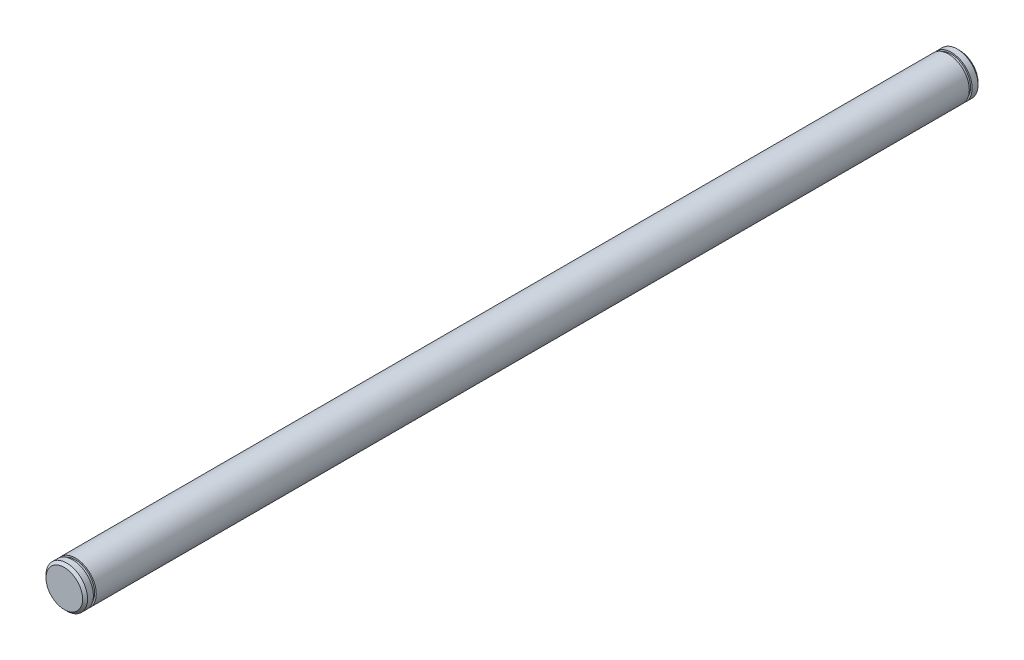
ISO-10303-21;
HEADER;
FILE_DESCRIPTION(('STEP AP214'),'2;1');
FILE_NAME('part.step','',(''),(''),'','','');
FILE_SCHEMA(('AUTOMOTIVE_DESIGN { 1 0 10303 214 1 1 1 1 }'));
ENDSEC;
DATA;
#1=APPLICATION_CONTEXT('core data for automotive mechanical design processes');
#2=APPLICATION_PROTOCOL_DEFINITION('international standard','automotive_design',2000,#1);
#3=PRODUCT_CONTEXT('',#1,'mechanical');
#4=PRODUCT('Part','Part','',(#3));
#5=PRODUCT_RELATED_PRODUCT_CATEGORY('part','',(#4));
#6=PRODUCT_DEFINITION_FORMATION('','',#4);
#7=PRODUCT_DEFINITION_CONTEXT('part definition',#1,'design');
#8=PRODUCT_DEFINITION('design','',#6,#7);
#9=PRODUCT_DEFINITION_SHAPE('','',#8);
#10=(LENGTH_UNIT() NAMED_UNIT(*) SI_UNIT(.MILLI.,.METRE.));
#11=(NAMED_UNIT(*) PLANE_ANGLE_UNIT() SI_UNIT($,.RADIAN.));
#12=(NAMED_UNIT(*) SI_UNIT($,.STERADIAN.) SOLID_ANGLE_UNIT());
#13=UNCERTAINTY_MEASURE_WITH_UNIT(LENGTH_MEASURE(1.E-05),#10,'distance_accuracy_value','');
#14=(GEOMETRIC_REPRESENTATION_CONTEXT(3) GLOBAL_UNCERTAINTY_ASSIGNED_CONTEXT((#13)) GLOBAL_UNIT_ASSIGNED_CONTEXT((#10,
#11,#12)) REPRESENTATION_CONTEXT('',''));
#15=CARTESIAN_POINT('',(0.,0.,0.));
#16=DIRECTION('',(0.,0.,1.));
#17=DIRECTION('',(1.,0.,0.));
#18=AXIS2_PLACEMENT_3D('',#15,#16,#17);
#19=CARTESIAN_POINT('',(0.,0.,133.4008));
#20=DIRECTION('',(0.,0.,1.));
#21=DIRECTION('',(1.,0.,0.));
#22=AXIS2_PLACEMENT_3D('',#19,#20,#21);
#23=PLANE('',#22);
#24=CARTESIAN_POINT('',(0.,0.,133.4008));
#25=DIRECTION('',(0.,0.,1.));
#26=DIRECTION('',(1.,0.,0.));
#27=AXIS2_PLACEMENT_3D('',#24,#25,#26);
#28=CIRCLE('',#27,6.35);
#29=CARTESIAN_POINT('',(6.35,0.,133.4008));
#30=VERTEX_POINT('',#29);
#31=EDGE_CURVE('E51',#30,#30,#28,.T.);
#32=ORIENTED_EDGE('',*,*,#31,.T.);
#33=EDGE_LOOP('',(#32));
#34=FACE_BOUND('',#33,.T.);
#35=CARTESIAN_POINT('',(0.,0.,133.4008));
#36=DIRECTION('',(0.,0.,1.));
#37=DIRECTION('',(1.,0.,0.));
#38=AXIS2_PLACEMENT_3D('',#35,#36,#37);
#39=CIRCLE('',#38,5.8547);
#40=CARTESIAN_POINT('',(5.8547,0.,133.4008));
#41=VERTEX_POINT('',#40);
#42=EDGE_CURVE('E58',#41,#41,#39,.T.);
#43=ORIENTED_EDGE('',*,*,#42,.F.);
#44=EDGE_LOOP('',(#43));
#45=FACE_BOUND('',#44,.T.);
#46=ADVANCED_FACE('F31',(#34,#45),#23,.T.);
#47=CARTESIAN_POINT('',(0.,0.,133.4008));
#48=DIRECTION('',(0.,0.,-1.));
#49=DIRECTION('',(-1.,0.,0.));
#50=AXIS2_PLACEMENT_3D('',#47,#48,#49);
#51=CYLINDRICAL_SURFACE('',#50,6.35);
#52=ORIENTED_EDGE('',*,*,#31,.F.);
#53=EDGE_LOOP('',(#52));
#54=FACE_BOUND('',#53,.T.);
#55=CARTESIAN_POINT('',(0.,0.,-133.4008));
#56=DIRECTION('',(0.,0.,1.));
#57=DIRECTION('',(1.,0.,0.));
#58=AXIS2_PLACEMENT_3D('',#55,#56,#57);
#59=CIRCLE('',#58,6.35);
#60=CARTESIAN_POINT('',(6.35,0.,-133.4008));
#61=VERTEX_POINT('',#60);
#62=EDGE_CURVE('E52',#61,#61,#59,.T.);
#63=ORIENTED_EDGE('',*,*,#62,.T.);
#64=EDGE_LOOP('',(#63));
#65=FACE_BOUND('',#64,.T.);
#66=ADVANCED_FACE('F93',(#54,#65),#51,.T.);
#67=CARTESIAN_POINT('',(0.,0.,-133.4008));
#68=DIRECTION('',(0.,0.,1.));
#69=DIRECTION('',(1.,0.,0.));
#70=AXIS2_PLACEMENT_3D('',#67,#68,#69);
#71=PLANE('',#70);
#72=CARTESIAN_POINT('',(0.,0.,-133.4008));
#73=DIRECTION('',(0.,0.,1.));
#74=DIRECTION('',(1.,0.,0.));
#75=AXIS2_PLACEMENT_3D('',#72,#73,#74);
#76=CIRCLE('',#75,5.8547);
#77=CARTESIAN_POINT('',(5.8547,0.,-133.4008));
#78=VERTEX_POINT('',#77);
#79=EDGE_CURVE('E66',#78,#78,#76,.T.);
#80=ORIENTED_EDGE('',*,*,#79,.T.);
#81=EDGE_LOOP('',(#80));
#82=FACE_BOUND('',#81,.T.);
#83=ORIENTED_EDGE('',*,*,#62,.F.);
#84=EDGE_LOOP('',(#83));
#85=FACE_BOUND('',#84,.T.);
#86=ADVANCED_FACE('F99',(#82,#85),#71,.F.);
#87=CARTESIAN_POINT('',(0.,0.,134.2898));
#88=DIRECTION('',(0.,0.,-1.));
#89=DIRECTION('',(-1.,0.,0.));
#90=AXIS2_PLACEMENT_3D('',#87,#88,#89);
#91=CYLINDRICAL_SURFACE('',#90,5.8547);
#92=CARTESIAN_POINT('',(0.,0.,134.2898));
#93=DIRECTION('',(0.,0.,1.));
#94=DIRECTION('',(1.,0.,0.));
#95=AXIS2_PLACEMENT_3D('',#92,#93,#94);
#96=CIRCLE('',#95,5.8547);
#97=CARTESIAN_POINT('',(5.8547,0.,134.2898));
#98=VERTEX_POINT('',#97);
#99=EDGE_CURVE('E55',#98,#98,#96,.T.);
#100=ORIENTED_EDGE('',*,*,#99,.F.);
#101=EDGE_LOOP('',(#100));
#102=FACE_BOUND('',#101,.T.);
#103=ORIENTED_EDGE('',*,*,#42,.T.);
#104=EDGE_LOOP('',(#103));
#105=FACE_BOUND('',#104,.T.);
#106=ADVANCED_FACE('F105',(#102,#105),#91,.T.);
#107=CARTESIAN_POINT('',(0.,0.,134.2898));
#108=DIRECTION('',(0.,0.,1.));
#109=DIRECTION('',(1.,0.,0.));
#110=AXIS2_PLACEMENT_3D('',#107,#108,#109);
#111=PLANE('',#110);
#112=CARTESIAN_POINT('',(0.,0.,134.2898));
#113=DIRECTION('',(0.,0.,1.));
#114=DIRECTION('',(1.,0.,0.));
#115=AXIS2_PLACEMENT_3D('',#112,#113,#114);
#116=CIRCLE('',#115,6.35);
#117=CARTESIAN_POINT('',(6.35,0.,134.2898));
#118=VERTEX_POINT('',#117);
#119=EDGE_CURVE('E61',#118,#118,#116,.T.);
#120=ORIENTED_EDGE('',*,*,#119,.F.);
#121=EDGE_LOOP('',(#120));
#122=FACE_BOUND('',#121,.T.);
#123=ORIENTED_EDGE('',*,*,#99,.T.);
#124=EDGE_LOOP('',(#123));
#125=FACE_BOUND('',#124,.T.);
#126=ADVANCED_FACE('F124',(#122,#125),#111,.F.);
#127=CARTESIAN_POINT('',(0.,0.,136.8298));
#128=DIRECTION('',(0.,0.,-1.));
#129=DIRECTION('',(-1.,0.,0.));
#130=AXIS2_PLACEMENT_3D('',#127,#128,#129);
#131=CYLINDRICAL_SURFACE('',#130,6.35);
#132=CARTESIAN_POINT('',(0.,0.,136.0678));
#133=DIRECTION('',(0.,0.,1.));
#134=DIRECTION('',(1.,0.,0.));
#135=AXIS2_PLACEMENT_3D('',#132,#133,#134);
#136=CIRCLE('',#135,6.35);
#137=CARTESIAN_POINT('',(-6.35000000000001,0.,136.0678));
#138=VERTEX_POINT('',#137);
#139=EDGE_CURVE('E42',#138,#138,#136,.F.);
#140=ORIENTED_EDGE('',*,*,#139,.T.);
#141=EDGE_LOOP('',(#140));
#142=FACE_BOUND('',#141,.T.);
#143=ORIENTED_EDGE('',*,*,#119,.T.);
#144=EDGE_LOOP('',(#143));
#145=FACE_BOUND('',#144,.T.);
#146=ADVANCED_FACE('F115',(#142,#145),#131,.T.);
#147=CARTESIAN_POINT('',(0.,0.,136.8298));
#148=DIRECTION('',(0.,0.,1.));
#149=DIRECTION('',(1.,0.,0.));
#150=AXIS2_PLACEMENT_3D('',#147,#148,#149);
#151=PLANE('',#150);
#152=CARTESIAN_POINT('',(0.,0.,136.8298));
#153=DIRECTION('',(0.,0.,1.));
#154=DIRECTION('',(1.,0.,0.));
#155=AXIS2_PLACEMENT_3D('',#152,#153,#154);
#156=CIRCLE('',#155,5.58800000000001);
#157=CARTESIAN_POINT('',(-5.58800000000002,0.,136.8298));
#158=VERTEX_POINT('',#157);
#159=EDGE_CURVE('E46',#158,#158,#156,.T.);
#160=ORIENTED_EDGE('',*,*,#159,.T.);
#161=EDGE_LOOP('',(#160));
#162=FACE_BOUND('',#161,.T.);
#163=ADVANCED_FACE('F110',(#162),#151,.T.);
#164=CARTESIAN_POINT('',(0.,0.,136.8298));
#165=DIRECTION('',(0.,0.,-1.));
#166=DIRECTION('',(-1.,0.,0.));
#167=AXIS2_PLACEMENT_3D('',#164,#165,#166);
#168=CONICAL_SURFACE('',#167,5.58800000000001,0.785398163397434);
#169=CARTESIAN_POINT('',(-6.35000000000001,0.,136.0678));
#170=CARTESIAN_POINT('',(-6.34206250000002,0.,136.0757375));
#171=CARTESIAN_POINT('',(-6.33412500000002,0.,136.083675));
#172=CARTESIAN_POINT('',(-6.31825000000002,0.,136.09955));
#173=CARTESIAN_POINT('',(-6.31031250000001,0.,136.1074875));
#174=CARTESIAN_POINT('',(-6.29443750000001,0.,136.1233625));
#175=CARTESIAN_POINT('',(-6.28650000000002,0.,136.1313));
#176=CARTESIAN_POINT('',(-6.27062500000001,0.,136.147175));
#177=CARTESIAN_POINT('',(-6.26268750000002,0.,136.1551125));
#178=CARTESIAN_POINT('',(-6.24681250000001,0.,136.1709875));
#179=CARTESIAN_POINT('',(-6.23887500000002,0.,136.178925));
#180=CARTESIAN_POINT('',(-6.22300000000001,0.,136.1948));
#181=CARTESIAN_POINT('',(-6.21506250000002,0.,136.2027375));
#182=CARTESIAN_POINT('',(-6.19918750000002,0.,136.2186125));
#183=CARTESIAN_POINT('',(-6.19125000000002,0.,136.22655));
#184=CARTESIAN_POINT('',(-6.17537500000002,0.,136.242425));
#185=CARTESIAN_POINT('',(-6.16743750000002,0.,136.2503625));
#186=CARTESIAN_POINT('',(-6.15156250000002,0.,136.2662375));
#187=CARTESIAN_POINT('',(-6.14362500000002,0.,136.274175));
#188=CARTESIAN_POINT('',(-6.12775000000001,0.,136.29005));
#189=CARTESIAN_POINT('',(-6.11981250000001,0.,136.2979875));
#190=CARTESIAN_POINT('',(-6.10393750000001,0.,136.3138625));
#191=CARTESIAN_POINT('',(-6.09600000000002,0.,136.3218));
#192=CARTESIAN_POINT('',(-6.08012500000002,0.,136.337675));
#193=CARTESIAN_POINT('',(-6.07218750000002,0.,136.3456125));
#194=CARTESIAN_POINT('',(-6.05631250000002,0.,136.3614875));
#195=CARTESIAN_POINT('',(-6.04837500000002,0.,136.369425));
#196=CARTESIAN_POINT('',(-6.03250000000002,0.,136.3853));
#197=CARTESIAN_POINT('',(-6.02456250000002,0.,136.3932375));
#198=CARTESIAN_POINT('',(-6.00868750000002,0.,136.4091125));
#199=CARTESIAN_POINT('',(-6.00075000000002,0.,136.41705));
#200=CARTESIAN_POINT('',(-5.98487500000002,0.,136.432925));
#201=CARTESIAN_POINT('',(-5.97693750000002,0.,136.4408625));
#202=CARTESIAN_POINT('',(-5.96106250000002,0.,136.4567375));
#203=CARTESIAN_POINT('',(-5.95312500000002,0.,136.464675));
#204=CARTESIAN_POINT('',(-5.93725000000002,0.,136.48055));
#205=CARTESIAN_POINT('',(-5.92931250000002,0.,136.4884875));
#206=CARTESIAN_POINT('',(-5.91343750000002,0.,136.5043625));
#207=CARTESIAN_POINT('',(-5.90550000000002,0.,136.5123));
#208=CARTESIAN_POINT('',(-5.88962500000002,0.,136.528175));
#209=CARTESIAN_POINT('',(-5.88168750000002,0.,136.5361125));
#210=CARTESIAN_POINT('',(-5.86581250000002,0.,136.5519875));
#211=CARTESIAN_POINT('',(-5.85787500000002,0.,136.559925));
#212=CARTESIAN_POINT('',(-5.84200000000002,0.,136.5758));
#213=CARTESIAN_POINT('',(-5.83406250000002,0.,136.5837375));
#214=CARTESIAN_POINT('',(-5.81818750000002,0.,136.5996125));
#215=CARTESIAN_POINT('',(-5.81025000000002,0.,136.60755));
#216=CARTESIAN_POINT('',(-5.79437500000002,0.,136.623425));
#217=CARTESIAN_POINT('',(-5.78643750000002,0.,136.6313625));
#218=CARTESIAN_POINT('',(-5.77056250000002,0.,136.6472375));
#219=CARTESIAN_POINT('',(-5.76262500000002,0.,136.655175));
#220=CARTESIAN_POINT('',(-5.74675000000002,0.,136.67105));
#221=CARTESIAN_POINT('',(-5.73881250000002,0.,136.6789875));
#222=CARTESIAN_POINT('',(-5.72293750000002,0.,136.6948625));
#223=CARTESIAN_POINT('',(-5.71500000000002,0.,136.7028));
#224=CARTESIAN_POINT('',(-5.69912500000002,0.,136.718675));
#225=CARTESIAN_POINT('',(-5.69118750000002,0.,136.7266125));
#226=CARTESIAN_POINT('',(-5.67531250000002,0.,136.7424875));
#227=CARTESIAN_POINT('',(-5.66737500000002,0.,136.750425));
#228=CARTESIAN_POINT('',(-5.65150000000002,0.,136.7663));
#229=CARTESIAN_POINT('',(-5.64356250000002,0.,136.7742375));
#230=CARTESIAN_POINT('',(-5.62768750000002,0.,136.7901125));
#231=CARTESIAN_POINT('',(-5.61975000000002,0.,136.79805));
#232=CARTESIAN_POINT('',(-5.60387500000002,0.,136.813925));
#233=CARTESIAN_POINT('',(-5.59593750000002,0.,136.8218625));
#234=CARTESIAN_POINT('',(-5.58800000000002,0.,136.8298));
#235=B_SPLINE_CURVE_WITH_KNOTS('',3,(#169,#170,#171,#172,#173,#174,#175,#176,#177,#178,#179,
#180,#181,#182,#183,#184,#185,#186,#187,#188,#189,#190,#191,#192,#193,#194,#195,#196,#197,#198,
#199,#200,#201,#202,#203,#204,#205,#206,#207,#208,#209,#210,#211,#212,#213,#214,#215,#216,#217,
#218,#219,#220,#221,#222,#223,#224,#225,#226,#227,#228,#229,#230,#231,#232,#233,#234),
.UNSPECIFIED.,.F.,.F.,(4,2,2,2,2,2,2,2,2,2,2,2,2,2,2,2,2,2,2,2,2,2,2,2,2,2,2,2,2,2,2,2,4),(0.,
0.0336759604540271,0.0673519209080345,0.101027881362042,0.134703841816049,0.168379802270057,
0.202055762724065,0.235731723178072,0.26940768363208,0.303083644086088,0.336759604540095,
0.370435564994122,0.40411152544813,0.437787485902137,0.471463446356145,0.505139406810153,
0.53881536726416,0.572491327718167,0.606167288172175,0.639843248626182,0.67351920908019,
0.707195169534198,0.740871129988225,0.774547090442232,0.808223050896239,0.841899011350247,
0.875574971804255,0.909250932258262,0.94292689271227,0.976602853166277,1.01027881362029,
1.04395477407429,1.07763073452832),.UNSPECIFIED.);
#236=EDGE_CURVE('BSEAM88',#138,#158,#235,.T.);
#237=ORIENTED_EDGE('',*,*,#139,.F.);
#238=ORIENTED_EDGE('',*,*,#159,.F.);
#239=ORIENTED_EDGE('',*,*,#236,.T.);
#240=ORIENTED_EDGE('',*,*,#236,.F.);
#241=EDGE_LOOP('',(#237,#239,#238,#240));
#242=FACE_BOUND('',#241,.T.);
#243=ADVANCED_FACE('F88',(#242),#168,.T.);
#244=CARTESIAN_POINT('',(0.,0.,-134.2898));
#245=DIRECTION('',(0.,0.,1.));
#246=DIRECTION('',(1.,0.,0.));
#247=AXIS2_PLACEMENT_3D('',#244,#245,#246);
#248=CYLINDRICAL_SURFACE('',#247,5.8547);
#249=CARTESIAN_POINT('',(0.,0.,-134.2898));
#250=DIRECTION('',(0.,0.,-1.));
#251=DIRECTION('',(-1.,0.,0.));
#252=AXIS2_PLACEMENT_3D('',#249,#250,#251);
#253=CIRCLE('',#252,5.8547);
#254=CARTESIAN_POINT('',(-5.8547,0.,-134.2898));
#255=VERTEX_POINT('',#254);
#256=EDGE_CURVE('E69',#255,#255,#253,.F.);
#257=ORIENTED_EDGE('',*,*,#256,.T.);
#258=EDGE_LOOP('',(#257));
#259=FACE_BOUND('',#258,.T.);
#260=ORIENTED_EDGE('',*,*,#79,.F.);
#261=EDGE_LOOP('',(#260));
#262=FACE_BOUND('',#261,.T.);
#263=ADVANCED_FACE('F81',(#259,#262),#248,.T.);
#264=CARTESIAN_POINT('',(0.,0.,-136.8298));
#265=DIRECTION('',(0.,0.,1.));
#266=DIRECTION('',(1.,0.,0.));
#267=AXIS2_PLACEMENT_3D('',#264,#265,#266);
#268=CYLINDRICAL_SURFACE('',#267,6.35);
#269=CARTESIAN_POINT('',(0.,0.,-136.0678));
#270=DIRECTION('',(0.,0.,-1.));
#271=DIRECTION('',(-1.,0.,0.));
#272=AXIS2_PLACEMENT_3D('',#269,#270,#271);
#273=CIRCLE('',#272,6.35);
#274=CARTESIAN_POINT('',(6.35000000000001,0.,-136.0678));
#275=VERTEX_POINT('',#274);
#276=EDGE_CURVE('E38',#275,#275,#273,.F.);
#277=ORIENTED_EDGE('',*,*,#276,.T.);
#278=EDGE_LOOP('',(#277));
#279=FACE_BOUND('',#278,.T.);
#280=CARTESIAN_POINT('',(0.,0.,-134.2898));
#281=DIRECTION('',(0.,0.,1.));
#282=DIRECTION('',(1.,0.,0.));
#283=AXIS2_PLACEMENT_3D('',#280,#281,#282);
#284=CIRCLE('',#283,6.35);
#285=CARTESIAN_POINT('',(6.35,0.,-134.2898));
#286=VERTEX_POINT('',#285);
#287=EDGE_CURVE('E72',#286,#286,#284,.T.);
#288=ORIENTED_EDGE('',*,*,#287,.F.);
#289=EDGE_LOOP('',(#288));
#290=FACE_BOUND('',#289,.T.);
#291=ADVANCED_FACE('F78',(#279,#290),#268,.T.);
#292=CARTESIAN_POINT('',(0.,0.,-136.8298));
#293=DIRECTION('',(0.,0.,-1.));
#294=DIRECTION('',(1.,0.,0.));
#295=AXIS2_PLACEMENT_3D('',#292,#293,#294);
#296=PLANE('',#295);
#297=CARTESIAN_POINT('',(0.,0.,-136.8298));
#298=DIRECTION('',(0.,0.,-1.));
#299=DIRECTION('',(-1.,0.,0.));
#300=AXIS2_PLACEMENT_3D('',#297,#298,#299);
#301=CIRCLE('',#300,5.58799999999999);
#302=CARTESIAN_POINT('',(5.58800000000001,0.,-136.8298));
#303=VERTEX_POINT('',#302);
#304=EDGE_CURVE('E10',#303,#303,#301,.T.);
#305=ORIENTED_EDGE('',*,*,#304,.T.);
#306=EDGE_LOOP('',(#305));
#307=FACE_BOUND('',#306,.T.);
#308=ADVANCED_FACE('F80',(#307),#296,.T.);
#309=CARTESIAN_POINT('',(0.,0.,-134.2898));
#310=DIRECTION('',(0.,0.,-1.));
#311=DIRECTION('',(1.,0.,0.));
#312=AXIS2_PLACEMENT_3D('',#309,#310,#311);
#313=PLANE('',#312);
#314=ORIENTED_EDGE('',*,*,#256,.F.);
#315=EDGE_LOOP('',(#314));
#316=FACE_BOUND('',#315,.T.);
#317=ORIENTED_EDGE('',*,*,#287,.T.);
#318=EDGE_LOOP('',(#317));
#319=FACE_BOUND('',#318,.T.);
#320=ADVANCED_FACE('F76',(#316,#319),#313,.F.);
#321=CARTESIAN_POINT('',(0.,0.,-136.0678));
#322=DIRECTION('',(0.,0.,1.));
#323=DIRECTION('',(1.,0.,0.));
#324=AXIS2_PLACEMENT_3D('',#321,#322,#323);
#325=CONICAL_SURFACE('',#324,6.35,0.785398163397444);
#326=CARTESIAN_POINT('',(5.58800000000001,0.,-136.8298));
#327=CARTESIAN_POINT('',(5.5959375,0.,-136.8218625));
#328=CARTESIAN_POINT('',(5.603875,0.,-136.813925));
#329=CARTESIAN_POINT('',(5.61975000000001,0.,-136.79805));
#330=CARTESIAN_POINT('',(5.62768750000001,0.,-136.7901125));
#331=CARTESIAN_POINT('',(5.64356250000001,0.,-136.7742375));
#332=CARTESIAN_POINT('',(5.65150000000001,0.,-136.7663));
#333=CARTESIAN_POINT('',(5.66737500000001,0.,-136.750425));
#334=CARTESIAN_POINT('',(5.67531250000001,0.,-136.7424875));
#335=CARTESIAN_POINT('',(5.69118750000001,0.,-136.7266125));
#336=CARTESIAN_POINT('',(5.69912500000001,0.,-136.718675));
#337=CARTESIAN_POINT('',(5.71500000000001,0.,-136.7028));
#338=CARTESIAN_POINT('',(5.72293750000001,0.,-136.6948625));
#339=CARTESIAN_POINT('',(5.73881250000001,0.,-136.6789875));
#340=CARTESIAN_POINT('',(5.74675000000001,0.,-136.67105));
#341=CARTESIAN_POINT('',(5.76262500000001,0.,-136.655175));
#342=CARTESIAN_POINT('',(5.77056250000001,0.,-136.6472375));
#343=CARTESIAN_POINT('',(5.78643750000001,0.,-136.6313625));
#344=CARTESIAN_POINT('',(5.79437500000001,0.,-136.623425));
#345=CARTESIAN_POINT('',(5.81025000000001,0.,-136.60755));
#346=CARTESIAN_POINT('',(5.81818750000001,0.,-136.5996125));
#347=CARTESIAN_POINT('',(5.83406250000001,0.,-136.5837375));
#348=CARTESIAN_POINT('',(5.84200000000001,0.,-136.5758));
#349=CARTESIAN_POINT('',(5.85787500000001,0.,-136.559925));
#350=CARTESIAN_POINT('',(5.86581250000001,0.,-136.5519875));
#351=CARTESIAN_POINT('',(5.88168750000001,0.,-136.5361125));
#352=CARTESIAN_POINT('',(5.88962500000001,0.,-136.528175));
#353=CARTESIAN_POINT('',(5.90550000000001,0.,-136.5123));
#354=CARTESIAN_POINT('',(5.91343750000001,0.,-136.5043625));
#355=CARTESIAN_POINT('',(5.92931250000001,0.,-136.4884875));
#356=CARTESIAN_POINT('',(5.93725000000001,0.,-136.48055));
#357=CARTESIAN_POINT('',(5.95312500000001,0.,-136.464675));
#358=CARTESIAN_POINT('',(5.96106250000001,0.,-136.4567375));
#359=CARTESIAN_POINT('',(5.97693750000001,0.,-136.4408625));
#360=CARTESIAN_POINT('',(5.98487500000001,0.,-136.432925));
#361=CARTESIAN_POINT('',(6.00075000000001,0.,-136.41705));
#362=CARTESIAN_POINT('',(6.00868750000001,0.,-136.4091125));
#363=CARTESIAN_POINT('',(6.02456250000001,0.,-136.3932375));
#364=CARTESIAN_POINT('',(6.03250000000001,0.,-136.3853));
#365=CARTESIAN_POINT('',(6.04837500000001,0.,-136.369425));
#366=CARTESIAN_POINT('',(6.05631250000001,0.,-136.3614875));
#367=CARTESIAN_POINT('',(6.07218750000001,0.,-136.3456125));
#368=CARTESIAN_POINT('',(6.08012500000001,0.,-136.337675));
#369=CARTESIAN_POINT('',(6.09600000000001,0.,-136.3218));
#370=CARTESIAN_POINT('',(6.10393750000001,0.,-136.3138625));
#371=CARTESIAN_POINT('',(6.11981250000001,0.,-136.2979875));
#372=CARTESIAN_POINT('',(6.12775000000001,0.,-136.29005));
#373=CARTESIAN_POINT('',(6.14362500000001,0.,-136.274175));
#374=CARTESIAN_POINT('',(6.15156250000001,0.,-136.2662375));
#375=CARTESIAN_POINT('',(6.16743750000001,0.,-136.2503625));
#376=CARTESIAN_POINT('',(6.17537500000001,0.,-136.242425));
#377=CARTESIAN_POINT('',(6.19125000000001,0.,-136.22655));
#378=CARTESIAN_POINT('',(6.19918750000001,0.,-136.2186125));
#379=CARTESIAN_POINT('',(6.21506250000001,0.,-136.2027375));
#380=CARTESIAN_POINT('',(6.22300000000001,0.,-136.1948));
#381=CARTESIAN_POINT('',(6.23887500000001,0.,-136.178925));
#382=CARTESIAN_POINT('',(6.24681250000001,0.,-136.1709875));
#383=CARTESIAN_POINT('',(6.26268750000001,0.,-136.1551125));
#384=CARTESIAN_POINT('',(6.27062500000001,0.,-136.147175));
#385=CARTESIAN_POINT('',(6.28650000000001,0.,-136.1313));
#386=CARTESIAN_POINT('',(6.29443750000001,0.,-136.1233625));
#387=CARTESIAN_POINT('',(6.31031250000001,0.,-136.1074875));
#388=CARTESIAN_POINT('',(6.31825000000001,0.,-136.09955));
#389=CARTESIAN_POINT('',(6.33412500000001,0.,-136.083675));
#390=CARTESIAN_POINT('',(6.34206250000001,0.,-136.0757375));
#391=CARTESIAN_POINT('',(6.35000000000001,0.,-136.0678));
#392=B_SPLINE_CURVE_WITH_KNOTS('',3,(#326,#327,#328,#329,#330,#331,#332,#333,#334,#335,#336,
#337,#338,#339,#340,#341,#342,#343,#344,#345,#346,#347,#348,#349,#350,#351,#352,#353,#354,#355,
#356,#357,#358,#359,#360,#361,#362,#363,#364,#365,#366,#367,#368,#369,#370,#371,#372,#373,#374,
#375,#376,#377,#378,#379,#380,#381,#382,#383,#384,#385,#386,#387,#388,#389,#390,#391),
.UNSPECIFIED.,.F.,.F.,(4,2,2,2,2,2,2,2,2,2,2,2,2,2,2,2,2,2,2,2,2,2,2,2,2,2,2,2,2,2,2,2,4),(0.,
0.0336759604540271,0.0673519209080351,0.101027881362043,0.134703841816051,0.168379802270059,
0.202055762724067,0.235731723178075,0.269407683632083,0.30308364408609,0.336759604540098,
0.370435564994126,0.404111525448134,0.437787485902142,0.471463446356149,0.505139406810157,
0.538815367264165,0.572491327718173,0.606167288172181,0.639843248626189,0.673519209080197,
0.707195169534205,0.740871129988232,0.77454709044224,0.808223050896248,0.841899011350256,
0.875574971804264,0.909250932258272,0.94292689271228,0.976602853166288,1.0102788136203,
1.0439547740743,1.07763073452831),.UNSPECIFIED.);
#393=EDGE_CURVE('BSEAM33',#303,#275,#392,.T.);
#394=ORIENTED_EDGE('',*,*,#304,.F.);
#395=ORIENTED_EDGE('',*,*,#276,.F.);
#396=ORIENTED_EDGE('',*,*,#393,.T.);
#397=ORIENTED_EDGE('',*,*,#393,.F.);
#398=EDGE_LOOP('',(#394,#396,#395,#397));
#399=FACE_BOUND('',#398,.T.);
#400=ADVANCED_FACE('F33',(#399),#325,.T.);
#401=CLOSED_SHELL('',(#46,#66,#86,#106,#126,#146,#163,#243,#263,#291,#308,#320,#400));
#402=MANIFOLD_SOLID_BREP('B2',#401);
#403=ADVANCED_BREP_SHAPE_REPRESENTATION('',(#18,#402),#14);
#404=SHAPE_DEFINITION_REPRESENTATION(#9,#403);
ENDSEC;
END-ISO-10303-21;
